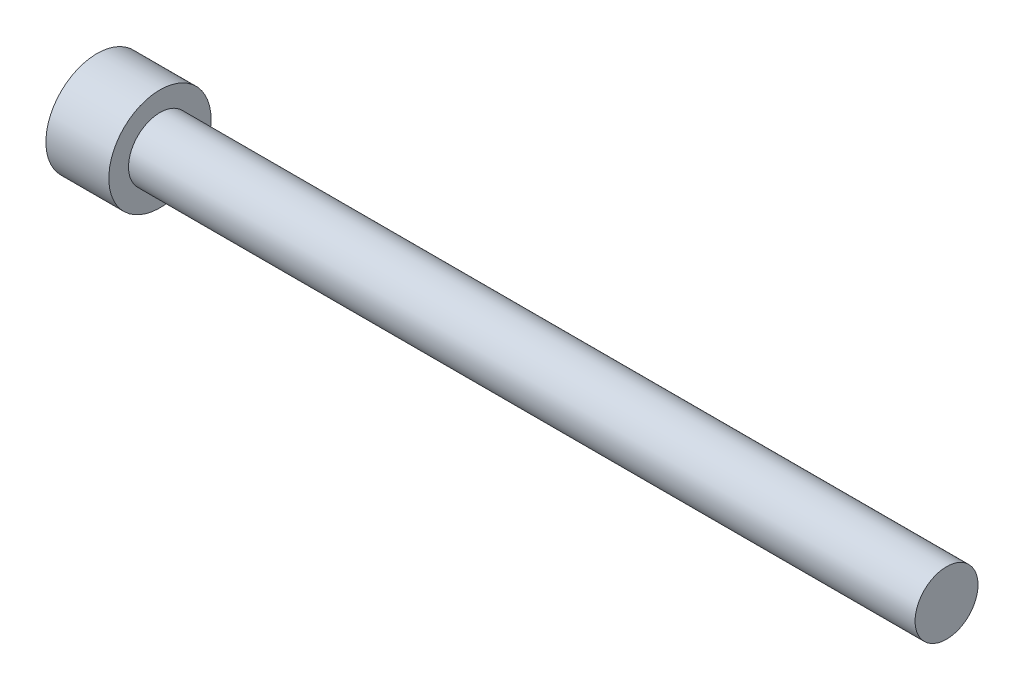
ISO-10303-21;
HEADER;
FILE_DESCRIPTION(('STEP AP214'),'2;1');
FILE_NAME('part.step','',(''),(''),'','','');
FILE_SCHEMA(('AUTOMOTIVE_DESIGN { 1 0 10303 214 1 1 1 1 }'));
ENDSEC;
DATA;
#1=APPLICATION_CONTEXT('core data for automotive mechanical design processes');
#2=APPLICATION_PROTOCOL_DEFINITION('international standard','automotive_design',2000,#1);
#3=PRODUCT_CONTEXT('',#1,'mechanical');
#4=PRODUCT('Part','Part','',(#3));
#5=PRODUCT_RELATED_PRODUCT_CATEGORY('part','',(#4));
#6=PRODUCT_DEFINITION_FORMATION('','',#4);
#7=PRODUCT_DEFINITION_CONTEXT('part definition',#1,'design');
#8=PRODUCT_DEFINITION('design','',#6,#7);
#9=PRODUCT_DEFINITION_SHAPE('','',#8);
#10=(LENGTH_UNIT() NAMED_UNIT(*) SI_UNIT(.MILLI.,.METRE.));
#11=(NAMED_UNIT(*) PLANE_ANGLE_UNIT() SI_UNIT($,.RADIAN.));
#12=(NAMED_UNIT(*) SI_UNIT($,.STERADIAN.) SOLID_ANGLE_UNIT());
#13=UNCERTAINTY_MEASURE_WITH_UNIT(LENGTH_MEASURE(1.E-05),#10,'distance_accuracy_value','');
#14=(GEOMETRIC_REPRESENTATION_CONTEXT(3) GLOBAL_UNCERTAINTY_ASSIGNED_CONTEXT((#13)) GLOBAL_UNIT_ASSIGNED_CONTEXT((#10,
#11,#12)) REPRESENTATION_CONTEXT('',''));
#15=CARTESIAN_POINT('',(0.,0.,0.));
#16=DIRECTION('',(0.,0.,1.));
#17=DIRECTION('',(1.,0.,0.));
#18=AXIS2_PLACEMENT_3D('',#15,#16,#17);
#19=CARTESIAN_POINT('',(8.,0.,0.));
#20=DIRECTION('',(-1.,0.,0.));
#21=DIRECTION('',(0.,0.,1.));
#22=AXIS2_PLACEMENT_3D('',#19,#20,#21);
#23=CYLINDRICAL_SURFACE('',#22,6.5);
#24=CARTESIAN_POINT('',(8.,0.,0.));
#25=DIRECTION('',(1.,0.,0.));
#26=DIRECTION('',(0.,0.,-1.));
#27=AXIS2_PLACEMENT_3D('',#24,#25,#26);
#28=CIRCLE('',#27,6.5);
#29=CARTESIAN_POINT('',(8.,0.,-6.5));
#30=VERTEX_POINT('',#29);
#31=EDGE_CURVE('E50',#30,#30,#28,.T.);
#32=ORIENTED_EDGE('',*,*,#31,.F.);
#33=EDGE_LOOP('',(#32));
#34=FACE_BOUND('',#33,.T.);
#35=CARTESIAN_POINT('',(0.,0.,0.));
#36=DIRECTION('',(1.,0.,0.));
#37=DIRECTION('',(0.,0.,-1.));
#38=AXIS2_PLACEMENT_3D('',#35,#36,#37);
#39=CIRCLE('',#38,6.5);
#40=CARTESIAN_POINT('',(0.,0.,-6.5));
#41=VERTEX_POINT('',#40);
#42=EDGE_CURVE('E45',#41,#41,#39,.T.);
#43=ORIENTED_EDGE('',*,*,#42,.T.);
#44=EDGE_LOOP('',(#43));
#45=FACE_BOUND('',#44,.T.);
#46=ADVANCED_FACE('F39',(#34,#45),#23,.T.);
#47=CARTESIAN_POINT('',(8.,0.,0.));
#48=DIRECTION('',(1.,0.,0.));
#49=DIRECTION('',(0.,0.,-1.));
#50=AXIS2_PLACEMENT_3D('',#47,#48,#49);
#51=PLANE('',#50);
#52=CARTESIAN_POINT('',(8.,0.,0.));
#53=DIRECTION('',(1.,0.,0.));
#54=DIRECTION('',(0.,0.,-1.));
#55=AXIS2_PLACEMENT_3D('',#52,#53,#54);
#56=CIRCLE('',#55,4.);
#57=CARTESIAN_POINT('',(8.,0.,-4.));
#58=VERTEX_POINT('',#57);
#59=EDGE_CURVE('E11',#58,#58,#56,.T.);
#60=ORIENTED_EDGE('',*,*,#59,.F.);
#61=EDGE_LOOP('',(#60));
#62=FACE_BOUND('',#61,.T.);
#63=ORIENTED_EDGE('',*,*,#31,.T.);
#64=EDGE_LOOP('',(#63));
#65=FACE_BOUND('',#64,.T.);
#66=ADVANCED_FACE('F160',(#62,#65),#51,.T.);
#67=CARTESIAN_POINT('',(0.,0.,0.));
#68=DIRECTION('',(1.,0.,0.));
#69=DIRECTION('',(0.,0.,-1.));
#70=AXIS2_PLACEMENT_3D('',#67,#68,#69);
#71=PLANE('',#70);
#72=DIRECTION('',(0.,0.5,0.866025403784438));
#73=VECTOR('',#72,1.);
#74=CARTESIAN_POINT('',(0.,-3.46410161513775,0.));
#75=LINE('',#74,#73);
#76=CARTESIAN_POINT('',(0.,-3.46410161513775,0.));
#77=VERTEX_POINT('',#76);
#78=CARTESIAN_POINT('',(0.,-1.73205080756888,3.));
#79=VERTEX_POINT('',#78);
#80=EDGE_CURVE('E129',#77,#79,#75,.T.);
#81=ORIENTED_EDGE('',*,*,#80,.F.);
#82=DIRECTION('',(0.,-0.5,0.866025403784439));
#83=VECTOR('',#82,1.);
#84=CARTESIAN_POINT('',(0.,-1.73205080756888,-3.));
#85=LINE('',#84,#83);
#86=CARTESIAN_POINT('',(0.,-1.73205080756888,-3.));
#87=VERTEX_POINT('',#86);
#88=EDGE_CURVE('E54',#87,#77,#85,.T.);
#89=ORIENTED_EDGE('',*,*,#88,.F.);
#90=DIRECTION('',(0.,-1.,0.));
#91=VECTOR('',#90,1.);
#92=CARTESIAN_POINT('',(0.,1.73205080756888,-3.));
#93=LINE('',#92,#91);
#94=CARTESIAN_POINT('',(0.,1.73205080756888,-3.));
#95=VERTEX_POINT('',#94);
#96=EDGE_CURVE('E138',#95,#87,#93,.T.);
#97=ORIENTED_EDGE('',*,*,#96,.F.);
#98=DIRECTION('',(0.,-0.5,-0.866025403784439));
#99=VECTOR('',#98,1.);
#100=CARTESIAN_POINT('',(0.,3.46410161513775,0.));
#101=LINE('',#100,#99);
#102=CARTESIAN_POINT('',(0.,3.46410161513775,0.));
#103=VERTEX_POINT('',#102);
#104=EDGE_CURVE('E136',#103,#95,#101,.T.);
#105=ORIENTED_EDGE('',*,*,#104,.F.);
#106=DIRECTION('',(0.,0.5,-0.866025403784438));
#107=VECTOR('',#106,1.);
#108=CARTESIAN_POINT('',(0.,1.73205080756888,3.));
#109=LINE('',#108,#107);
#110=CARTESIAN_POINT('',(0.,1.73205080756888,3.));
#111=VERTEX_POINT('',#110);
#112=EDGE_CURVE('E103',#111,#103,#109,.T.);
#113=ORIENTED_EDGE('',*,*,#112,.F.);
#114=DIRECTION('',(0.,1.,0.));
#115=VECTOR('',#114,1.);
#116=CARTESIAN_POINT('',(0.,-1.73205080756888,3.));
#117=LINE('',#116,#115);
#118=EDGE_CURVE('E135',#79,#111,#117,.T.);
#119=ORIENTED_EDGE('',*,*,#118,.F.);
#120=EDGE_LOOP('',(#81,#89,#97,#105,#113,#119));
#121=FACE_BOUND('',#120,.T.);
#122=ORIENTED_EDGE('',*,*,#42,.F.);
#123=EDGE_LOOP('',(#122));
#124=FACE_BOUND('',#123,.T.);
#125=ADVANCED_FACE('F152',(#121,#124),#71,.F.);
#126=CARTESIAN_POINT('',(4.,-1.73205080756888,-3.));
#127=DIRECTION('',(0.,-0.866025403784439,-0.5));
#128=DIRECTION('',(0.,0.5,-0.866025403784439));
#129=AXIS2_PLACEMENT_3D('',#126,#127,#128);
#130=PLANE('',#129);
#131=ORIENTED_EDGE('',*,*,#88,.T.);
#132=DIRECTION('',(-1.,0.,0.));
#133=VECTOR('',#132,1.);
#134=CARTESIAN_POINT('',(4.,-3.46410161513775,0.));
#135=LINE('',#134,#133);
#136=CARTESIAN_POINT('',(4.,-3.46410161513775,0.));
#137=VERTEX_POINT('',#136);
#138=EDGE_CURVE('E82',#137,#77,#135,.T.);
#139=ORIENTED_EDGE('',*,*,#138,.F.);
#140=DIRECTION('',(0.,-0.5,0.866025403784439));
#141=VECTOR('',#140,1.);
#142=CARTESIAN_POINT('',(4.,-1.73205080756888,-3.));
#143=LINE('',#142,#141);
#144=CARTESIAN_POINT('',(4.,-1.73205080756888,-3.));
#145=VERTEX_POINT('',#144);
#146=EDGE_CURVE('E143',#145,#137,#143,.T.);
#147=ORIENTED_EDGE('',*,*,#146,.F.);
#148=DIRECTION('',(-1.,0.,0.));
#149=VECTOR('',#148,1.);
#150=CARTESIAN_POINT('',(4.,-1.73205080756888,-3.));
#151=LINE('',#150,#149);
#152=EDGE_CURVE('E65',#145,#87,#151,.T.);
#153=ORIENTED_EDGE('',*,*,#152,.T.);
#154=EDGE_LOOP('',(#131,#139,#147,#153));
#155=FACE_BOUND('',#154,.T.);
#156=ADVANCED_FACE('F156',(#155),#130,.F.);
#157=CARTESIAN_POINT('',(4.,1.73205080756888,-3.));
#158=DIRECTION('',(0.,0.,-1.));
#159=DIRECTION('',(0.,1.,0.));
#160=AXIS2_PLACEMENT_3D('',#157,#158,#159);
#161=PLANE('',#160);
#162=ORIENTED_EDGE('',*,*,#96,.T.);
#163=ORIENTED_EDGE('',*,*,#152,.F.);
#164=DIRECTION('',(0.,-1.,0.));
#165=VECTOR('',#164,1.);
#166=CARTESIAN_POINT('',(4.,1.73205080756888,-3.));
#167=LINE('',#166,#165);
#168=CARTESIAN_POINT('',(4.,1.73205080756888,-3.));
#169=VERTEX_POINT('',#168);
#170=EDGE_CURVE('E113',#169,#145,#167,.T.);
#171=ORIENTED_EDGE('',*,*,#170,.F.);
#172=DIRECTION('',(-1.,0.,0.));
#173=VECTOR('',#172,1.);
#174=CARTESIAN_POINT('',(4.,1.73205080756888,-3.));
#175=LINE('',#174,#173);
#176=EDGE_CURVE('E110',#169,#95,#175,.T.);
#177=ORIENTED_EDGE('',*,*,#176,.T.);
#178=EDGE_LOOP('',(#162,#163,#171,#177));
#179=FACE_BOUND('',#178,.T.);
#180=ADVANCED_FACE('F162',(#179),#161,.F.);
#181=CARTESIAN_POINT('',(4.,3.46410161513775,0.));
#182=DIRECTION('',(0.,0.866025403784439,-0.5));
#183=DIRECTION('',(0.,0.5,0.866025403784439));
#184=AXIS2_PLACEMENT_3D('',#181,#182,#183);
#185=PLANE('',#184);
#186=ORIENTED_EDGE('',*,*,#104,.T.);
#187=ORIENTED_EDGE('',*,*,#176,.F.);
#188=DIRECTION('',(0.,-0.5,-0.866025403784439));
#189=VECTOR('',#188,1.);
#190=CARTESIAN_POINT('',(4.,3.46410161513775,0.));
#191=LINE('',#190,#189);
#192=CARTESIAN_POINT('',(4.,3.46410161513775,0.));
#193=VERTEX_POINT('',#192);
#194=EDGE_CURVE('E112',#193,#169,#191,.T.);
#195=ORIENTED_EDGE('',*,*,#194,.F.);
#196=DIRECTION('',(-1.,0.,0.));
#197=VECTOR('',#196,1.);
#198=CARTESIAN_POINT('',(4.,3.46410161513775,0.));
#199=LINE('',#198,#197);
#200=EDGE_CURVE('E96',#193,#103,#199,.T.);
#201=ORIENTED_EDGE('',*,*,#200,.T.);
#202=EDGE_LOOP('',(#186,#187,#195,#201));
#203=FACE_BOUND('',#202,.T.);
#204=ADVANCED_FACE('F115',(#203),#185,.F.);
#205=CARTESIAN_POINT('',(4.,1.73205080756888,3.));
#206=DIRECTION('',(0.,0.866025403784439,0.5));
#207=DIRECTION('',(0.,-0.5,0.866025403784439));
#208=AXIS2_PLACEMENT_3D('',#205,#206,#207);
#209=PLANE('',#208);
#210=ORIENTED_EDGE('',*,*,#112,.T.);
#211=ORIENTED_EDGE('',*,*,#200,.F.);
#212=DIRECTION('',(0.,0.5,-0.866025403784438));
#213=VECTOR('',#212,1.);
#214=CARTESIAN_POINT('',(4.,1.73205080756888,3.));
#215=LINE('',#214,#213);
#216=CARTESIAN_POINT('',(4.,1.73205080756888,3.));
#217=VERTEX_POINT('',#216);
#218=EDGE_CURVE('E99',#217,#193,#215,.T.);
#219=ORIENTED_EDGE('',*,*,#218,.F.);
#220=DIRECTION('',(-1.,0.,0.));
#221=VECTOR('',#220,1.);
#222=CARTESIAN_POINT('',(4.,1.73205080756888,3.));
#223=LINE('',#222,#221);
#224=EDGE_CURVE('E107',#217,#111,#223,.T.);
#225=ORIENTED_EDGE('',*,*,#224,.T.);
#226=EDGE_LOOP('',(#210,#211,#219,#225));
#227=FACE_BOUND('',#226,.T.);
#228=ADVANCED_FACE('F98',(#227),#209,.F.);
#229=CARTESIAN_POINT('',(4.,-1.73205080756888,3.));
#230=DIRECTION('',(0.,0.,1.));
#231=DIRECTION('',(1.,0.,0.));
#232=AXIS2_PLACEMENT_3D('',#229,#230,#231);
#233=PLANE('',#232);
#234=ORIENTED_EDGE('',*,*,#118,.T.);
#235=ORIENTED_EDGE('',*,*,#224,.F.);
#236=DIRECTION('',(0.,1.,0.));
#237=VECTOR('',#236,1.);
#238=CARTESIAN_POINT('',(4.,-1.73205080756888,3.));
#239=LINE('',#238,#237);
#240=CARTESIAN_POINT('',(4.,-1.73205080756888,3.));
#241=VERTEX_POINT('',#240);
#242=EDGE_CURVE('E124',#241,#217,#239,.T.);
#243=ORIENTED_EDGE('',*,*,#242,.F.);
#244=DIRECTION('',(-1.,0.,0.));
#245=VECTOR('',#244,1.);
#246=CARTESIAN_POINT('',(4.,-1.73205080756888,3.));
#247=LINE('',#246,#245);
#248=EDGE_CURVE('E144',#241,#79,#247,.T.);
#249=ORIENTED_EDGE('',*,*,#248,.T.);
#250=EDGE_LOOP('',(#234,#235,#243,#249));
#251=FACE_BOUND('',#250,.T.);
#252=ADVANCED_FACE('F216',(#251),#233,.F.);
#253=CARTESIAN_POINT('',(4.,-3.46410161513775,0.));
#254=DIRECTION('',(0.,-0.866025403784438,0.5));
#255=DIRECTION('',(0.,-0.5,-0.866025403784439));
#256=AXIS2_PLACEMENT_3D('',#253,#254,#255);
#257=PLANE('',#256);
#258=ORIENTED_EDGE('',*,*,#80,.T.);
#259=ORIENTED_EDGE('',*,*,#248,.F.);
#260=DIRECTION('',(0.,0.5,0.866025403784438));
#261=VECTOR('',#260,1.);
#262=CARTESIAN_POINT('',(4.,-3.46410161513775,0.));
#263=LINE('',#262,#261);
#264=EDGE_CURVE('E125',#137,#241,#263,.T.);
#265=ORIENTED_EDGE('',*,*,#264,.F.);
#266=ORIENTED_EDGE('',*,*,#138,.T.);
#267=EDGE_LOOP('',(#258,#259,#265,#266));
#268=FACE_BOUND('',#267,.T.);
#269=ADVANCED_FACE('F223',(#268),#257,.F.);
#270=CARTESIAN_POINT('',(4.,0.,0.));
#271=DIRECTION('',(-1.,0.,0.));
#272=DIRECTION('',(0.,0.,1.));
#273=AXIS2_PLACEMENT_3D('',#270,#271,#272);
#274=PLANE('',#273);
#275=ORIENTED_EDGE('',*,*,#146,.T.);
#276=ORIENTED_EDGE('',*,*,#264,.T.);
#277=ORIENTED_EDGE('',*,*,#242,.T.);
#278=ORIENTED_EDGE('',*,*,#218,.T.);
#279=ORIENTED_EDGE('',*,*,#194,.T.);
#280=ORIENTED_EDGE('',*,*,#170,.T.);
#281=EDGE_LOOP('',(#275,#276,#277,#278,#279,#280));
#282=FACE_BOUND('',#281,.T.);
#283=ADVANCED_FACE('F120',(#282),#274,.T.);
#284=CARTESIAN_POINT('',(108.,0.,0.));
#285=DIRECTION('',(-1.,0.,0.));
#286=DIRECTION('',(0.,0.,1.));
#287=AXIS2_PLACEMENT_3D('',#284,#285,#286);
#288=CYLINDRICAL_SURFACE('',#287,4.);
#289=CARTESIAN_POINT('',(108.,0.,0.));
#290=DIRECTION('',(1.,0.,0.));
#291=DIRECTION('',(0.,0.,-1.));
#292=AXIS2_PLACEMENT_3D('',#289,#290,#291);
#293=CIRCLE('',#292,4.);
#294=CARTESIAN_POINT('',(108.,0.,-4.));
#295=VERTEX_POINT('',#294);
#296=EDGE_CURVE('E128',#295,#295,#293,.T.);
#297=ORIENTED_EDGE('',*,*,#296,.F.);
#298=EDGE_LOOP('',(#297));
#299=FACE_BOUND('',#298,.T.);
#300=ORIENTED_EDGE('',*,*,#59,.T.);
#301=EDGE_LOOP('',(#300));
#302=FACE_BOUND('',#301,.T.);
#303=ADVANCED_FACE('F245',(#299,#302),#288,.T.);
#304=CARTESIAN_POINT('',(108.,0.,0.));
#305=DIRECTION('',(1.,0.,0.));
#306=DIRECTION('',(0.,0.,-1.));
#307=AXIS2_PLACEMENT_3D('',#304,#305,#306);
#308=PLANE('',#307);
#309=ORIENTED_EDGE('',*,*,#296,.T.);
#310=EDGE_LOOP('',(#309));
#311=FACE_BOUND('',#310,.T.);
#312=ADVANCED_FACE('F253',(#311),#308,.T.);
#313=CLOSED_SHELL('',(#46,#66,#125,#156,#180,#204,#228,#252,#269,#283,#303,#312));
#314=MANIFOLD_SOLID_BREP('B2',#313);
#315=ADVANCED_BREP_SHAPE_REPRESENTATION('',(#18,#314),#14);
#316=SHAPE_DEFINITION_REPRESENTATION(#9,#315);
ENDSEC;
END-ISO-10303-21;
